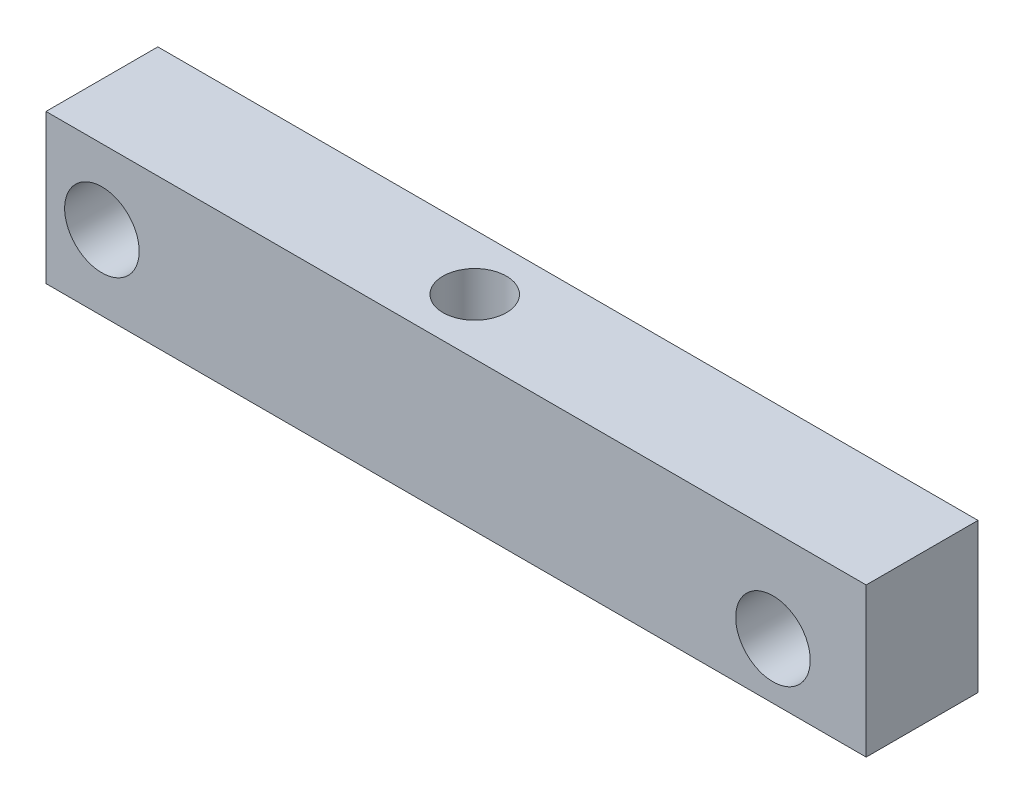
ISO-10303-21;
HEADER;
FILE_DESCRIPTION(('STEP AP214'),'2;1');
FILE_NAME('part.step','',(''),(''),'','','');
FILE_SCHEMA(('AUTOMOTIVE_DESIGN { 1 0 10303 214 1 1 1 1 }'));
ENDSEC;
DATA;
#1=APPLICATION_CONTEXT('core data for automotive mechanical design processes');
#2=APPLICATION_PROTOCOL_DEFINITION('international standard','automotive_design',2000,#1);
#3=PRODUCT_CONTEXT('',#1,'mechanical');
#4=PRODUCT('Part','Part','',(#3));
#5=PRODUCT_RELATED_PRODUCT_CATEGORY('part','',(#4));
#6=PRODUCT_DEFINITION_FORMATION('','',#4);
#7=PRODUCT_DEFINITION_CONTEXT('part definition',#1,'design');
#8=PRODUCT_DEFINITION('design','',#6,#7);
#9=PRODUCT_DEFINITION_SHAPE('','',#8);
#10=(LENGTH_UNIT() NAMED_UNIT(*) SI_UNIT(.MILLI.,.METRE.));
#11=(NAMED_UNIT(*) PLANE_ANGLE_UNIT() SI_UNIT($,.RADIAN.));
#12=(NAMED_UNIT(*) SI_UNIT($,.STERADIAN.) SOLID_ANGLE_UNIT());
#13=UNCERTAINTY_MEASURE_WITH_UNIT(LENGTH_MEASURE(1.E-05),#10,'distance_accuracy_value','');
#14=(GEOMETRIC_REPRESENTATION_CONTEXT(3) GLOBAL_UNCERTAINTY_ASSIGNED_CONTEXT((#13)) GLOBAL_UNIT_ASSIGNED_CONTEXT((#10,
#11,#12)) REPRESENTATION_CONTEXT('',''));
#15=CARTESIAN_POINT('',(0.,0.,0.));
#16=DIRECTION('',(0.,0.,1.));
#17=DIRECTION('',(1.,0.,0.));
#18=AXIS2_PLACEMENT_3D('',#15,#16,#17);
#19=CARTESIAN_POINT('',(11.,-2.,3.));
#20=DIRECTION('',(-1.,0.,0.));
#21=DIRECTION('',(0.,0.,1.));
#22=AXIS2_PLACEMENT_3D('',#19,#20,#21);
#23=PLANE('',#22);
#24=DIRECTION('',(0.,1.,0.));
#25=VECTOR('',#24,1.);
#26=CARTESIAN_POINT('',(11.,-2.,0.));
#27=LINE('',#26,#25);
#28=CARTESIAN_POINT('',(11.,-2.,0.));
#29=VERTEX_POINT('',#28);
#30=CARTESIAN_POINT('',(11.,2.,0.));
#31=VERTEX_POINT('',#30);
#32=EDGE_CURVE('E111',#29,#31,#27,.T.);
#33=ORIENTED_EDGE('',*,*,#32,.T.);
#34=DIRECTION('',(0.,0.,-1.));
#35=VECTOR('',#34,1.);
#36=CARTESIAN_POINT('',(11.,2.,3.));
#37=LINE('',#36,#35);
#38=CARTESIAN_POINT('',(11.,2.,3.));
#39=VERTEX_POINT('',#38);
#40=EDGE_CURVE('E11',#39,#31,#37,.T.);
#41=ORIENTED_EDGE('',*,*,#40,.F.);
#42=DIRECTION('',(0.,1.,0.));
#43=VECTOR('',#42,1.);
#44=CARTESIAN_POINT('',(11.,-2.,3.));
#45=LINE('',#44,#43);
#46=CARTESIAN_POINT('',(11.,-2.,3.));
#47=VERTEX_POINT('',#46);
#48=EDGE_CURVE('E95',#47,#39,#45,.T.);
#49=ORIENTED_EDGE('',*,*,#48,.F.);
#50=DIRECTION('',(0.,0.,-1.));
#51=VECTOR('',#50,1.);
#52=CARTESIAN_POINT('',(11.,-2.,3.));
#53=LINE('',#52,#51);
#54=EDGE_CURVE('E107',#47,#29,#53,.T.);
#55=ORIENTED_EDGE('',*,*,#54,.T.);
#56=EDGE_LOOP('',(#33,#41,#49,#55));
#57=FACE_BOUND('',#56,.T.);
#58=ADVANCED_FACE('F43',(#57),#23,.F.);
#59=CARTESIAN_POINT('',(-11.,2.,3.));
#60=DIRECTION('',(0.,-1.,0.));
#61=DIRECTION('',(0.,0.,-1.));
#62=AXIS2_PLACEMENT_3D('',#59,#60,#61);
#63=PLANE('',#62);
#64=CARTESIAN_POINT('',(-1.,2.,1.5));
#65=DIRECTION('',(0.,1.,0.));
#66=DIRECTION('',(0.,0.,1.));
#67=AXIS2_PLACEMENT_3D('',#64,#65,#66);
#68=CIRCLE('',#67,0.85);
#69=CARTESIAN_POINT('',(-1.,2.,2.35));
#70=VERTEX_POINT('',#69);
#71=EDGE_CURVE('E132',#70,#70,#68,.T.);
#72=ORIENTED_EDGE('',*,*,#71,.F.);
#73=EDGE_LOOP('',(#72));
#74=FACE_BOUND('',#73,.T.);
#75=DIRECTION('',(-1.,0.,0.));
#76=VECTOR('',#75,1.);
#77=CARTESIAN_POINT('',(-11.,2.,0.));
#78=LINE('',#77,#76);
#79=CARTESIAN_POINT('',(-11.,2.,0.));
#80=VERTEX_POINT('',#79);
#81=EDGE_CURVE('E100',#31,#80,#78,.T.);
#82=ORIENTED_EDGE('',*,*,#81,.T.);
#83=DIRECTION('',(0.,0.,-1.));
#84=VECTOR('',#83,1.);
#85=CARTESIAN_POINT('',(-11.,2.,3.));
#86=LINE('',#85,#84);
#87=CARTESIAN_POINT('',(-11.,2.,3.));
#88=VERTEX_POINT('',#87);
#89=EDGE_CURVE('E52',#88,#80,#86,.T.);
#90=ORIENTED_EDGE('',*,*,#89,.F.);
#91=DIRECTION('',(-1.,0.,0.));
#92=VECTOR('',#91,1.);
#93=CARTESIAN_POINT('',(-11.,2.,3.));
#94=LINE('',#93,#92);
#95=EDGE_CURVE('E90',#39,#88,#94,.T.);
#96=ORIENTED_EDGE('',*,*,#95,.F.);
#97=ORIENTED_EDGE('',*,*,#40,.T.);
#98=EDGE_LOOP('',(#82,#90,#96,#97));
#99=FACE_BOUND('',#98,.T.);
#100=ADVANCED_FACE('F99',(#74,#99),#63,.F.);
#101=CARTESIAN_POINT('',(-11.,-2.,3.));
#102=DIRECTION('',(1.,0.,0.));
#103=DIRECTION('',(0.,0.,-1.));
#104=AXIS2_PLACEMENT_3D('',#101,#102,#103);
#105=PLANE('',#104);
#106=DIRECTION('',(0.,-1.,0.));
#107=VECTOR('',#106,1.);
#108=CARTESIAN_POINT('',(-11.,-2.,0.));
#109=LINE('',#108,#107);
#110=CARTESIAN_POINT('',(-11.,-2.,0.));
#111=VERTEX_POINT('',#110);
#112=EDGE_CURVE('E77',#80,#111,#109,.T.);
#113=ORIENTED_EDGE('',*,*,#112,.T.);
#114=DIRECTION('',(0.,0.,-1.));
#115=VECTOR('',#114,1.);
#116=CARTESIAN_POINT('',(-11.,-2.,3.));
#117=LINE('',#116,#115);
#118=CARTESIAN_POINT('',(-11.,-2.,3.));
#119=VERTEX_POINT('',#118);
#120=EDGE_CURVE('E102',#119,#111,#117,.T.);
#121=ORIENTED_EDGE('',*,*,#120,.F.);
#122=DIRECTION('',(0.,-1.,0.));
#123=VECTOR('',#122,1.);
#124=CARTESIAN_POINT('',(-11.,-2.,3.));
#125=LINE('',#124,#123);
#126=EDGE_CURVE('E93',#88,#119,#125,.T.);
#127=ORIENTED_EDGE('',*,*,#126,.F.);
#128=ORIENTED_EDGE('',*,*,#89,.T.);
#129=EDGE_LOOP('',(#113,#121,#127,#128));
#130=FACE_BOUND('',#129,.T.);
#131=ADVANCED_FACE('F103',(#130),#105,.F.);
#132=CARTESIAN_POINT('',(-11.,-2.,3.));
#133=DIRECTION('',(0.,1.,0.));
#134=DIRECTION('',(0.,0.,1.));
#135=AXIS2_PLACEMENT_3D('',#132,#133,#134);
#136=PLANE('',#135);
#137=DIRECTION('',(1.,0.,0.));
#138=VECTOR('',#137,1.);
#139=CARTESIAN_POINT('',(-11.,-2.,0.));
#140=LINE('',#139,#138);
#141=EDGE_CURVE('E83',#111,#29,#140,.T.);
#142=ORIENTED_EDGE('',*,*,#141,.T.);
#143=ORIENTED_EDGE('',*,*,#54,.F.);
#144=DIRECTION('',(1.,0.,0.));
#145=VECTOR('',#144,1.);
#146=CARTESIAN_POINT('',(-11.,-2.,3.));
#147=LINE('',#146,#145);
#148=EDGE_CURVE('E60',#119,#47,#147,.T.);
#149=ORIENTED_EDGE('',*,*,#148,.F.);
#150=ORIENTED_EDGE('',*,*,#120,.T.);
#151=EDGE_LOOP('',(#142,#143,#149,#150));
#152=FACE_BOUND('',#151,.T.);
#153=ADVANCED_FACE('F125',(#152),#136,.F.);
#154=CARTESIAN_POINT('',(0.,0.,3.));
#155=DIRECTION('',(0.,0.,-1.));
#156=DIRECTION('',(-1.,0.,0.));
#157=AXIS2_PLACEMENT_3D('',#154,#155,#156);
#158=PLANE('',#157);
#159=CARTESIAN_POINT('',(8.5,-0.5,3.));
#160=DIRECTION('',(0.,0.,1.));
#161=DIRECTION('',(1.,0.,0.));
#162=AXIS2_PLACEMENT_3D('',#159,#160,#161);
#163=CIRCLE('',#162,1.);
#164=CARTESIAN_POINT('',(9.5,-0.5,3.));
#165=VERTEX_POINT('',#164);
#166=EDGE_CURVE('E136',#165,#165,#163,.T.);
#167=ORIENTED_EDGE('',*,*,#166,.F.);
#168=EDGE_LOOP('',(#167));
#169=FACE_BOUND('',#168,.T.);
#170=CARTESIAN_POINT('',(-9.5,0.,3.));
#171=DIRECTION('',(0.,0.,1.));
#172=DIRECTION('',(1.,0.,0.));
#173=AXIS2_PLACEMENT_3D('',#170,#171,#172);
#174=CIRCLE('',#173,1.);
#175=CARTESIAN_POINT('',(-8.5,0.,3.));
#176=VERTEX_POINT('',#175);
#177=EDGE_CURVE('E140',#176,#176,#174,.T.);
#178=ORIENTED_EDGE('',*,*,#177,.F.);
#179=EDGE_LOOP('',(#178));
#180=FACE_BOUND('',#179,.T.);
#181=ORIENTED_EDGE('',*,*,#48,.T.);
#182=ORIENTED_EDGE('',*,*,#95,.T.);
#183=ORIENTED_EDGE('',*,*,#126,.T.);
#184=ORIENTED_EDGE('',*,*,#148,.T.);
#185=EDGE_LOOP('',(#181,#182,#183,#184));
#186=FACE_BOUND('',#185,.T.);
#187=ADVANCED_FACE('F91',(#169,#180,#186),#158,.F.);
#188=CARTESIAN_POINT('',(0.,0.,0.));
#189=DIRECTION('',(0.,0.,-1.));
#190=DIRECTION('',(-1.,0.,0.));
#191=AXIS2_PLACEMENT_3D('',#188,#189,#190);
#192=PLANE('',#191);
#193=CARTESIAN_POINT('',(8.5,-0.5,0.));
#194=DIRECTION('',(0.,0.,-1.));
#195=DIRECTION('',(-1.,0.,0.));
#196=AXIS2_PLACEMENT_3D('',#193,#194,#195);
#197=CIRCLE('',#196,1.);
#198=CARTESIAN_POINT('',(9.5,-0.5,0.));
#199=VERTEX_POINT('',#198);
#200=EDGE_CURVE('E148',#199,#199,#197,.F.);
#201=ORIENTED_EDGE('',*,*,#200,.T.);
#202=EDGE_LOOP('',(#201));
#203=FACE_BOUND('',#202,.T.);
#204=CARTESIAN_POINT('',(-9.5,0.,0.));
#205=DIRECTION('',(0.,0.,-1.));
#206=DIRECTION('',(-1.,0.,0.));
#207=AXIS2_PLACEMENT_3D('',#204,#205,#206);
#208=CIRCLE('',#207,1.);
#209=CARTESIAN_POINT('',(-8.5,0.,0.));
#210=VERTEX_POINT('',#209);
#211=EDGE_CURVE('E144',#210,#210,#208,.F.);
#212=ORIENTED_EDGE('',*,*,#211,.T.);
#213=EDGE_LOOP('',(#212));
#214=FACE_BOUND('',#213,.T.);
#215=ORIENTED_EDGE('',*,*,#32,.F.);
#216=ORIENTED_EDGE('',*,*,#141,.F.);
#217=ORIENTED_EDGE('',*,*,#112,.F.);
#218=ORIENTED_EDGE('',*,*,#81,.F.);
#219=EDGE_LOOP('',(#215,#216,#217,#218));
#220=FACE_BOUND('',#219,.T.);
#221=ADVANCED_FACE('F128',(#203,#214,#220),#192,.T.);
#222=CARTESIAN_POINT('',(-1.,-1.,1.5));
#223=DIRECTION('',(0.,1.,0.));
#224=DIRECTION('',(0.,0.,1.));
#225=AXIS2_PLACEMENT_3D('',#222,#223,#224);
#226=CYLINDRICAL_SURFACE('',#225,0.85);
#227=CARTESIAN_POINT('',(-1.,-1.,1.5));
#228=DIRECTION('',(0.,1.,0.));
#229=DIRECTION('',(0.,0.,1.));
#230=AXIS2_PLACEMENT_3D('',#227,#228,#229);
#231=CIRCLE('',#230,0.85);
#232=CARTESIAN_POINT('',(-1.,-1.,2.35));
#233=VERTEX_POINT('',#232);
#234=EDGE_CURVE('E115',#233,#233,#231,.T.);
#235=ORIENTED_EDGE('',*,*,#234,.F.);
#236=EDGE_LOOP('',(#235));
#237=FACE_BOUND('',#236,.T.);
#238=ORIENTED_EDGE('',*,*,#71,.T.);
#239=EDGE_LOOP('',(#238));
#240=FACE_BOUND('',#239,.T.);
#241=ADVANCED_FACE('F174',(#237,#240),#226,.F.);
#242=CARTESIAN_POINT('',(-1.,-1.,1.5));
#243=DIRECTION('',(0.,1.,0.));
#244=DIRECTION('',(0.,0.,1.));
#245=AXIS2_PLACEMENT_3D('',#242,#243,#244);
#246=PLANE('',#245);
#247=ORIENTED_EDGE('',*,*,#234,.T.);
#248=EDGE_LOOP('',(#247));
#249=FACE_BOUND('',#248,.T.);
#250=ADVANCED_FACE('F165',(#249),#246,.T.);
#251=CARTESIAN_POINT('',(-9.5,0.,-0.00100000000000013));
#252=DIRECTION('',(0.,0.,1.));
#253=DIRECTION('',(1.,0.,0.));
#254=AXIS2_PLACEMENT_3D('',#251,#252,#253);
#255=CYLINDRICAL_SURFACE('',#254,1.);
#256=CARTESIAN_POINT('',(-8.5,0.,0.));
#257=CARTESIAN_POINT('',(-8.5,0.,0.03125));
#258=CARTESIAN_POINT('',(-8.5,0.,0.0625));
#259=CARTESIAN_POINT('',(-8.5,0.,0.125));
#260=CARTESIAN_POINT('',(-8.5,0.,0.15625));
#261=CARTESIAN_POINT('',(-8.5,0.,0.21875));
#262=CARTESIAN_POINT('',(-8.5,0.,0.25));
#263=CARTESIAN_POINT('',(-8.5,0.,0.3125));
#264=CARTESIAN_POINT('',(-8.5,0.,0.34375));
#265=CARTESIAN_POINT('',(-8.5,0.,0.40625));
#266=CARTESIAN_POINT('',(-8.5,0.,0.4375));
#267=CARTESIAN_POINT('',(-8.5,0.,0.5));
#268=CARTESIAN_POINT('',(-8.5,0.,0.53125));
#269=CARTESIAN_POINT('',(-8.5,0.,0.59375));
#270=CARTESIAN_POINT('',(-8.5,0.,0.625));
#271=CARTESIAN_POINT('',(-8.5,0.,0.6875));
#272=CARTESIAN_POINT('',(-8.5,0.,0.71875));
#273=CARTESIAN_POINT('',(-8.5,0.,0.78125));
#274=CARTESIAN_POINT('',(-8.5,0.,0.8125));
#275=CARTESIAN_POINT('',(-8.5,0.,0.875));
#276=CARTESIAN_POINT('',(-8.5,0.,0.90625));
#277=CARTESIAN_POINT('',(-8.5,0.,0.96875));
#278=CARTESIAN_POINT('',(-8.5,0.,1.));
#279=CARTESIAN_POINT('',(-8.5,0.,1.0625));
#280=CARTESIAN_POINT('',(-8.5,0.,1.09375));
#281=CARTESIAN_POINT('',(-8.5,0.,1.15625));
#282=CARTESIAN_POINT('',(-8.5,0.,1.1875));
#283=CARTESIAN_POINT('',(-8.5,0.,1.25));
#284=CARTESIAN_POINT('',(-8.5,0.,1.28125));
#285=CARTESIAN_POINT('',(-8.5,0.,1.34375));
#286=CARTESIAN_POINT('',(-8.5,0.,1.375));
#287=CARTESIAN_POINT('',(-8.5,0.,1.4375));
#288=CARTESIAN_POINT('',(-8.5,0.,1.46875));
#289=CARTESIAN_POINT('',(-8.5,0.,1.53125));
#290=CARTESIAN_POINT('',(-8.5,0.,1.5625));
#291=CARTESIAN_POINT('',(-8.5,0.,1.625));
#292=CARTESIAN_POINT('',(-8.5,0.,1.65625));
#293=CARTESIAN_POINT('',(-8.5,0.,1.71875));
#294=CARTESIAN_POINT('',(-8.5,0.,1.75));
#295=CARTESIAN_POINT('',(-8.5,0.,1.8125));
#296=CARTESIAN_POINT('',(-8.5,0.,1.84375));
#297=CARTESIAN_POINT('',(-8.5,0.,1.90625));
#298=CARTESIAN_POINT('',(-8.5,0.,1.9375));
#299=CARTESIAN_POINT('',(-8.5,0.,2.));
#300=CARTESIAN_POINT('',(-8.5,0.,2.03125));
#301=CARTESIAN_POINT('',(-8.5,0.,2.09375));
#302=CARTESIAN_POINT('',(-8.5,0.,2.125));
#303=CARTESIAN_POINT('',(-8.5,0.,2.1875));
#304=CARTESIAN_POINT('',(-8.5,0.,2.21875));
#305=CARTESIAN_POINT('',(-8.5,0.,2.28125));
#306=CARTESIAN_POINT('',(-8.5,0.,2.3125));
#307=CARTESIAN_POINT('',(-8.5,0.,2.375));
#308=CARTESIAN_POINT('',(-8.5,0.,2.40625));
#309=CARTESIAN_POINT('',(-8.5,0.,2.46875));
#310=CARTESIAN_POINT('',(-8.5,0.,2.5));
#311=CARTESIAN_POINT('',(-8.5,0.,2.5625));
#312=CARTESIAN_POINT('',(-8.5,0.,2.59375));
#313=CARTESIAN_POINT('',(-8.5,0.,2.65625));
#314=CARTESIAN_POINT('',(-8.5,0.,2.6875));
#315=CARTESIAN_POINT('',(-8.5,0.,2.75));
#316=CARTESIAN_POINT('',(-8.5,0.,2.78125));
#317=CARTESIAN_POINT('',(-8.5,0.,2.84375));
#318=CARTESIAN_POINT('',(-8.5,0.,2.875));
#319=CARTESIAN_POINT('',(-8.5,0.,2.9375));
#320=CARTESIAN_POINT('',(-8.5,0.,2.96875));
#321=CARTESIAN_POINT('',(-8.5,0.,3.));
#322=B_SPLINE_CURVE_WITH_KNOTS('',3,(#256,#257,#258,#259,#260,#261,#262,#263,#264,#265,#266,
#267,#268,#269,#270,#271,#272,#273,#274,#275,#276,#277,#278,#279,#280,#281,#282,#283,#284,#285,
#286,#287,#288,#289,#290,#291,#292,#293,#294,#295,#296,#297,#298,#299,#300,#301,#302,#303,#304,
#305,#306,#307,#308,#309,#310,#311,#312,#313,#314,#315,#316,#317,#318,#319,#320,#321),
.UNSPECIFIED.,.F.,.F.,(4,2,2,2,2,2,2,2,2,2,2,2,2,2,2,2,2,2,2,2,2,2,2,2,2,2,2,2,2,2,2,2,4),(0.,
0.09375,0.1875,0.28125,0.375,0.46875,0.5625,0.65625,0.75,0.84375,0.9375,1.03125,1.125,1.21875,
1.3125,1.40625,1.5,1.59375,1.6875,1.78125,1.875,1.96875,2.0625,2.15625,2.25,2.34375,2.4375,
2.53125,2.625,2.71875,2.8125,2.90625,3.),.UNSPECIFIED.);
#323=EDGE_CURVE('BSEAM163',#210,#176,#322,.T.);
#324=ORIENTED_EDGE('',*,*,#211,.F.);
#325=ORIENTED_EDGE('',*,*,#177,.T.);
#326=ORIENTED_EDGE('',*,*,#323,.T.);
#327=ORIENTED_EDGE('',*,*,#323,.F.);
#328=EDGE_LOOP('',(#324,#326,#325,#327));
#329=FACE_BOUND('',#328,.T.);
#330=ADVANCED_FACE('F163',(#329),#255,.F.);
#331=CARTESIAN_POINT('',(8.5,-0.5,-0.00100000000000013));
#332=DIRECTION('',(0.,0.,1.));
#333=DIRECTION('',(1.,0.,0.));
#334=AXIS2_PLACEMENT_3D('',#331,#332,#333);
#335=CYLINDRICAL_SURFACE('',#334,1.);
#336=CARTESIAN_POINT('',(9.5,-0.5,0.));
#337=CARTESIAN_POINT('',(9.5,-0.5,0.03125));
#338=CARTESIAN_POINT('',(9.5,-0.5,0.0625));
#339=CARTESIAN_POINT('',(9.5,-0.5,0.125));
#340=CARTESIAN_POINT('',(9.5,-0.5,0.15625));
#341=CARTESIAN_POINT('',(9.5,-0.5,0.21875));
#342=CARTESIAN_POINT('',(9.5,-0.5,0.25));
#343=CARTESIAN_POINT('',(9.5,-0.5,0.3125));
#344=CARTESIAN_POINT('',(9.5,-0.5,0.34375));
#345=CARTESIAN_POINT('',(9.5,-0.5,0.40625));
#346=CARTESIAN_POINT('',(9.5,-0.5,0.4375));
#347=CARTESIAN_POINT('',(9.5,-0.5,0.5));
#348=CARTESIAN_POINT('',(9.5,-0.5,0.53125));
#349=CARTESIAN_POINT('',(9.5,-0.5,0.59375));
#350=CARTESIAN_POINT('',(9.5,-0.5,0.625));
#351=CARTESIAN_POINT('',(9.5,-0.5,0.6875));
#352=CARTESIAN_POINT('',(9.5,-0.5,0.71875));
#353=CARTESIAN_POINT('',(9.5,-0.5,0.78125));
#354=CARTESIAN_POINT('',(9.5,-0.5,0.8125));
#355=CARTESIAN_POINT('',(9.5,-0.5,0.875));
#356=CARTESIAN_POINT('',(9.5,-0.5,0.90625));
#357=CARTESIAN_POINT('',(9.5,-0.5,0.96875));
#358=CARTESIAN_POINT('',(9.5,-0.5,1.));
#359=CARTESIAN_POINT('',(9.5,-0.5,1.0625));
#360=CARTESIAN_POINT('',(9.5,-0.5,1.09375));
#361=CARTESIAN_POINT('',(9.5,-0.5,1.15625));
#362=CARTESIAN_POINT('',(9.5,-0.5,1.1875));
#363=CARTESIAN_POINT('',(9.5,-0.5,1.25));
#364=CARTESIAN_POINT('',(9.5,-0.5,1.28125));
#365=CARTESIAN_POINT('',(9.5,-0.5,1.34375));
#366=CARTESIAN_POINT('',(9.5,-0.5,1.375));
#367=CARTESIAN_POINT('',(9.5,-0.5,1.4375));
#368=CARTESIAN_POINT('',(9.5,-0.5,1.46875));
#369=CARTESIAN_POINT('',(9.5,-0.5,1.53125));
#370=CARTESIAN_POINT('',(9.5,-0.5,1.5625));
#371=CARTESIAN_POINT('',(9.5,-0.5,1.625));
#372=CARTESIAN_POINT('',(9.5,-0.5,1.65625));
#373=CARTESIAN_POINT('',(9.5,-0.5,1.71875));
#374=CARTESIAN_POINT('',(9.5,-0.5,1.75));
#375=CARTESIAN_POINT('',(9.5,-0.5,1.8125));
#376=CARTESIAN_POINT('',(9.5,-0.5,1.84375));
#377=CARTESIAN_POINT('',(9.5,-0.5,1.90625));
#378=CARTESIAN_POINT('',(9.5,-0.5,1.9375));
#379=CARTESIAN_POINT('',(9.5,-0.5,2.));
#380=CARTESIAN_POINT('',(9.5,-0.5,2.03125));
#381=CARTESIAN_POINT('',(9.5,-0.5,2.09375));
#382=CARTESIAN_POINT('',(9.5,-0.5,2.125));
#383=CARTESIAN_POINT('',(9.5,-0.5,2.1875));
#384=CARTESIAN_POINT('',(9.5,-0.5,2.21875));
#385=CARTESIAN_POINT('',(9.5,-0.5,2.28125));
#386=CARTESIAN_POINT('',(9.5,-0.5,2.3125));
#387=CARTESIAN_POINT('',(9.5,-0.5,2.375));
#388=CARTESIAN_POINT('',(9.5,-0.5,2.40625));
#389=CARTESIAN_POINT('',(9.5,-0.5,2.46875));
#390=CARTESIAN_POINT('',(9.5,-0.5,2.5));
#391=CARTESIAN_POINT('',(9.5,-0.5,2.5625));
#392=CARTESIAN_POINT('',(9.5,-0.5,2.59375));
#393=CARTESIAN_POINT('',(9.5,-0.5,2.65625));
#394=CARTESIAN_POINT('',(9.5,-0.5,2.6875));
#395=CARTESIAN_POINT('',(9.5,-0.5,2.75));
#396=CARTESIAN_POINT('',(9.5,-0.5,2.78125));
#397=CARTESIAN_POINT('',(9.5,-0.5,2.84375));
#398=CARTESIAN_POINT('',(9.5,-0.5,2.875));
#399=CARTESIAN_POINT('',(9.5,-0.5,2.9375));
#400=CARTESIAN_POINT('',(9.5,-0.5,2.96875));
#401=CARTESIAN_POINT('',(9.5,-0.5,3.));
#402=B_SPLINE_CURVE_WITH_KNOTS('',3,(#336,#337,#338,#339,#340,#341,#342,#343,#344,#345,#346,
#347,#348,#349,#350,#351,#352,#353,#354,#355,#356,#357,#358,#359,#360,#361,#362,#363,#364,#365,
#366,#367,#368,#369,#370,#371,#372,#373,#374,#375,#376,#377,#378,#379,#380,#381,#382,#383,#384,
#385,#386,#387,#388,#389,#390,#391,#392,#393,#394,#395,#396,#397,#398,#399,#400,#401),
.UNSPECIFIED.,.F.,.F.,(4,2,2,2,2,2,2,2,2,2,2,2,2,2,2,2,2,2,2,2,2,2,2,2,2,2,2,2,2,2,2,2,4),(0.,
0.09375,0.1875,0.28125,0.375,0.46875,0.5625,0.65625,0.75,0.84375,0.9375,1.03125,1.125,1.21875,
1.3125,1.40625,1.5,1.59375,1.6875,1.78125,1.875,1.96875,2.0625,2.15625,2.25,2.34375,2.4375,
2.53125,2.625,2.71875,2.8125,2.90625,3.),.UNSPECIFIED.);
#403=EDGE_CURVE('BSEAM156',#199,#165,#402,.T.);
#404=ORIENTED_EDGE('',*,*,#200,.F.);
#405=ORIENTED_EDGE('',*,*,#166,.T.);
#406=ORIENTED_EDGE('',*,*,#403,.T.);
#407=ORIENTED_EDGE('',*,*,#403,.F.);
#408=EDGE_LOOP('',(#404,#406,#405,#407));
#409=FACE_BOUND('',#408,.T.);
#410=ADVANCED_FACE('F156',(#409),#335,.F.);
#411=CLOSED_SHELL('',(#58,#100,#131,#153,#187,#221,#241,#250,#330,#410));
#412=MANIFOLD_SOLID_BREP('B2',#411);
#413=ADVANCED_BREP_SHAPE_REPRESENTATION('',(#18,#412),#14);
#414=SHAPE_DEFINITION_REPRESENTATION(#9,#413);
ENDSEC;
END-ISO-10303-21;
